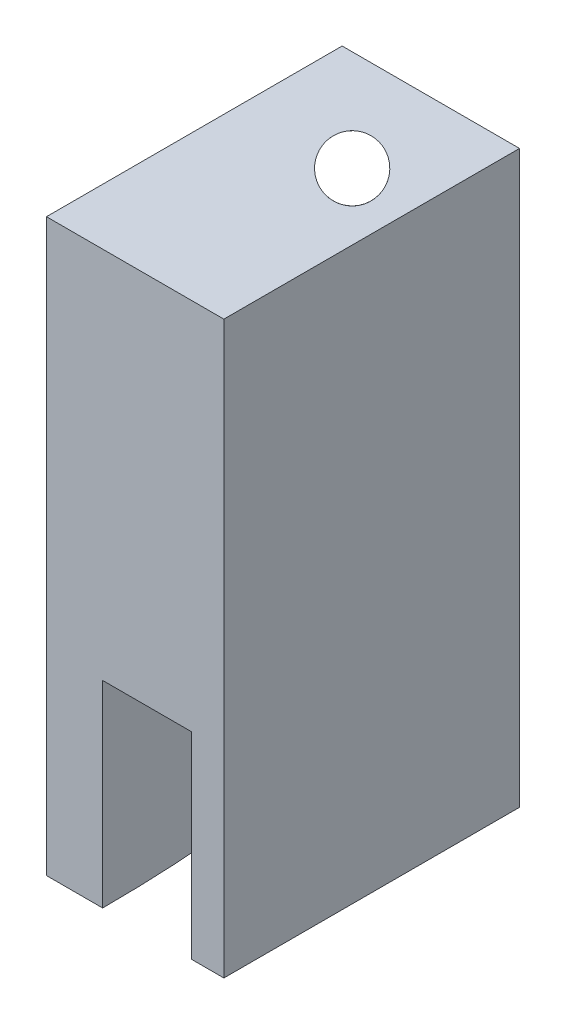
ISO-10303-21;
HEADER;
FILE_DESCRIPTION(('STEP AP214'),'2;1');
FILE_NAME('part.step','',(''),(''),'','','');
FILE_SCHEMA(('AUTOMOTIVE_DESIGN { 1 0 10303 214 1 1 1 1 }'));
ENDSEC;
DATA;
#1=APPLICATION_CONTEXT('core data for automotive mechanical design processes');
#2=APPLICATION_PROTOCOL_DEFINITION('international standard','automotive_design',2000,#1);
#3=PRODUCT_CONTEXT('',#1,'mechanical');
#4=PRODUCT('Part','Part','',(#3));
#5=PRODUCT_RELATED_PRODUCT_CATEGORY('part','',(#4));
#6=PRODUCT_DEFINITION_FORMATION('','',#4);
#7=PRODUCT_DEFINITION_CONTEXT('part definition',#1,'design');
#8=PRODUCT_DEFINITION('design','',#6,#7);
#9=PRODUCT_DEFINITION_SHAPE('','',#8);
#10=(LENGTH_UNIT() NAMED_UNIT(*) SI_UNIT(.MILLI.,.METRE.));
#11=(NAMED_UNIT(*) PLANE_ANGLE_UNIT() SI_UNIT($,.RADIAN.));
#12=(NAMED_UNIT(*) SI_UNIT($,.STERADIAN.) SOLID_ANGLE_UNIT());
#13=UNCERTAINTY_MEASURE_WITH_UNIT(LENGTH_MEASURE(1.E-05),#10,'distance_accuracy_value','');
#14=(GEOMETRIC_REPRESENTATION_CONTEXT(3) GLOBAL_UNCERTAINTY_ASSIGNED_CONTEXT((#13)) GLOBAL_UNIT_ASSIGNED_CONTEXT((#10,
#11,#12)) REPRESENTATION_CONTEXT('',''));
#15=CARTESIAN_POINT('',(0.,0.,0.));
#16=DIRECTION('',(0.,0.,1.));
#17=DIRECTION('',(1.,0.,0.));
#18=AXIS2_PLACEMENT_3D('',#15,#16,#17);
#19=CARTESIAN_POINT('',(123.5,42.,0.));
#20=DIRECTION('',(0.,0.,-1.));
#21=DIRECTION('',(-1.,0.,0.));
#22=AXIS2_PLACEMENT_3D('',#19,#20,#21);
#23=PLANE('',#22);
#24=DIRECTION('',(0.,-1.,0.));
#25=VECTOR('',#24,1.);
#26=CARTESIAN_POINT('',(113.25,16.6666666666667,0.));
#27=LINE('',#26,#25);
#28=CARTESIAN_POINT('',(113.25,16.6666666666667,0.));
#29=VERTEX_POINT('',#28);
#30=CARTESIAN_POINT('',(113.25,0.,0.));
#31=VERTEX_POINT('',#30);
#32=EDGE_CURVE('E155',#29,#31,#27,.T.);
#33=ORIENTED_EDGE('',*,*,#32,.F.);
#34=DIRECTION('',(1.,0.,0.));
#35=VECTOR('',#34,1.);
#36=CARTESIAN_POINT('',(113.25,16.6666666666667,0.));
#37=LINE('',#36,#35);
#38=CARTESIAN_POINT('',(120.75,16.6666666666667,0.));
#39=VERTEX_POINT('',#38);
#40=EDGE_CURVE('E176',#29,#39,#37,.T.);
#41=ORIENTED_EDGE('',*,*,#40,.T.);
#42=DIRECTION('',(0.,-1.,0.));
#43=VECTOR('',#42,1.);
#44=CARTESIAN_POINT('',(120.75,16.6666666666667,0.));
#45=LINE('',#44,#43);
#46=CARTESIAN_POINT('',(120.75,0.,0.));
#47=VERTEX_POINT('',#46);
#48=EDGE_CURVE('E157',#39,#47,#45,.T.);
#49=ORIENTED_EDGE('',*,*,#48,.T.);
#50=DIRECTION('',(1.,0.,0.));
#51=VECTOR('',#50,1.);
#52=CARTESIAN_POINT('',(123.5,0.,0.));
#53=LINE('',#52,#51);
#54=CARTESIAN_POINT('',(123.5,0.,0.));
#55=VERTEX_POINT('',#54);
#56=EDGE_CURVE('E145',#47,#55,#53,.T.);
#57=ORIENTED_EDGE('',*,*,#56,.T.);
#58=DIRECTION('',(0.,-1.,0.));
#59=VECTOR('',#58,1.);
#60=CARTESIAN_POINT('',(123.5,42.,0.));
#61=LINE('',#60,#59);
#62=CARTESIAN_POINT('',(123.5,48.25,0.));
#63=VERTEX_POINT('',#62);
#64=EDGE_CURVE('E45',#63,#55,#61,.T.);
#65=ORIENTED_EDGE('',*,*,#64,.F.);
#66=DIRECTION('',(1.,0.,0.));
#67=VECTOR('',#66,1.);
#68=CARTESIAN_POINT('',(108.5,48.25,0.));
#69=LINE('',#68,#67);
#70=CARTESIAN_POINT('',(108.5,48.25,0.));
#71=VERTEX_POINT('',#70);
#72=EDGE_CURVE('E183',#71,#63,#69,.T.);
#73=ORIENTED_EDGE('',*,*,#72,.F.);
#74=DIRECTION('',(0.,-1.,0.));
#75=VECTOR('',#74,1.);
#76=CARTESIAN_POINT('',(108.5,42.,0.));
#77=LINE('',#76,#75);
#78=CARTESIAN_POINT('',(108.5,0.,0.));
#79=VERTEX_POINT('',#78);
#80=EDGE_CURVE('E11',#71,#79,#77,.T.);
#81=ORIENTED_EDGE('',*,*,#80,.T.);
#82=EDGE_CURVE('E148',#79,#31,#53,.T.);
#83=ORIENTED_EDGE('',*,*,#82,.T.);
#84=EDGE_LOOP('',(#33,#41,#49,#57,#65,#73,#81,#83));
#85=FACE_BOUND('',#84,.T.);
#86=ADVANCED_FACE('F36',(#85),#23,.F.);
#87=CARTESIAN_POINT('',(123.5,42.,-25.));
#88=DIRECTION('',(0.,0.,1.));
#89=DIRECTION('',(1.,0.,0.));
#90=AXIS2_PLACEMENT_3D('',#87,#88,#89);
#91=PLANE('',#90);
#92=CARTESIAN_POINT('',(109.350288425444,39.7189330655249,-25.));
#93=DIRECTION('',(0.,0.,1.));
#94=DIRECTION('',(-0.707164241221047,-0.707049316482422,0.));
#95=AXIS2_PLACEMENT_3D('',#92,#93,#94);
#96=ELLIPSE('',#95,3.89690321539582,2.25);
#97=CARTESIAN_POINT('',(108.5,41.9491815174221,-25.));
#98=VERTEX_POINT('',#97);
#99=CARTESIAN_POINT('',(108.5,36.6385343727372,-25.));
#100=VERTEX_POINT('',#99);
#101=EDGE_CURVE('E51',#98,#100,#96,.F.);
#102=ORIENTED_EDGE('',*,*,#101,.F.);
#103=DIRECTION('',(0.,-1.,0.));
#104=VECTOR('',#103,1.);
#105=CARTESIAN_POINT('',(108.5,42.,-25.));
#106=LINE('',#105,#104);
#107=CARTESIAN_POINT('',(108.5,48.25,-25.));
#108=VERTEX_POINT('',#107);
#109=EDGE_CURVE('E114',#108,#98,#106,.T.);
#110=ORIENTED_EDGE('',*,*,#109,.F.);
#111=DIRECTION('',(-1.,0.,0.));
#112=VECTOR('',#111,1.);
#113=CARTESIAN_POINT('',(108.5,48.25,-25.));
#114=LINE('',#113,#112);
#115=CARTESIAN_POINT('',(123.5,48.25,-25.));
#116=VERTEX_POINT('',#115);
#117=EDGE_CURVE('E171',#116,#108,#114,.T.);
#118=ORIENTED_EDGE('',*,*,#117,.F.);
#119=DIRECTION('',(0.,-1.,0.));
#120=VECTOR('',#119,1.);
#121=CARTESIAN_POINT('',(123.5,42.,-25.));
#122=LINE('',#121,#120);
#123=CARTESIAN_POINT('',(123.5,0.,-25.));
#124=VERTEX_POINT('',#123);
#125=EDGE_CURVE('E122',#116,#124,#122,.T.);
#126=ORIENTED_EDGE('',*,*,#125,.T.);
#127=DIRECTION('',(-1.,0.,0.));
#128=VECTOR('',#127,1.);
#129=CARTESIAN_POINT('',(123.5,0.,-25.));
#130=LINE('',#129,#128);
#131=CARTESIAN_POINT('',(118.133663703451,0.,-25.));
#132=VERTEX_POINT('',#131);
#133=EDGE_CURVE('E126',#124,#132,#130,.T.);
#134=ORIENTED_EDGE('',*,*,#133,.T.);
#135=DIRECTION('',(0.,-1.,0.));
#136=VECTOR('',#135,1.);
#137=CARTESIAN_POINT('',(118.133663703451,16.6666666666667,-25.));
#138=LINE('',#137,#136);
#139=CARTESIAN_POINT('',(118.133663703451,16.6666666666667,-25.));
#140=VERTEX_POINT('',#139);
#141=EDGE_CURVE('E59',#140,#132,#138,.T.);
#142=ORIENTED_EDGE('',*,*,#141,.F.);
#143=DIRECTION('',(-1.,0.,0.));
#144=VECTOR('',#143,1.);
#145=CARTESIAN_POINT('',(110.45615646038,16.6666666666667,-25.));
#146=LINE('',#145,#144);
#147=CARTESIAN_POINT('',(110.45615646038,16.6666666666667,-25.));
#148=VERTEX_POINT('',#147);
#149=EDGE_CURVE('E164',#140,#148,#146,.T.);
#150=ORIENTED_EDGE('',*,*,#149,.T.);
#151=DIRECTION('',(0.,-1.,0.));
#152=VECTOR('',#151,1.);
#153=CARTESIAN_POINT('',(110.45615646038,16.6666666666667,-25.));
#154=LINE('',#153,#152);
#155=CARTESIAN_POINT('',(110.45615646038,0.,-25.));
#156=VERTEX_POINT('',#155);
#157=EDGE_CURVE('E161',#148,#156,#154,.T.);
#158=ORIENTED_EDGE('',*,*,#157,.T.);
#159=CARTESIAN_POINT('',(108.5,0.,-25.));
#160=VERTEX_POINT('',#159);
#161=EDGE_CURVE('E147',#156,#160,#130,.T.);
#162=ORIENTED_EDGE('',*,*,#161,.T.);
#163=EDGE_CURVE('E117',#100,#160,#106,.T.);
#164=ORIENTED_EDGE('',*,*,#163,.F.);
#165=EDGE_LOOP('',(#102,#110,#118,#126,#134,#142,#150,#158,#162,#164));
#166=FACE_BOUND('',#165,.T.);
#167=ADVANCED_FACE('F112',(#166),#91,.F.);
#168=CARTESIAN_POINT('',(0.,0.,0.));
#169=DIRECTION('',(0.,-1.,0.));
#170=DIRECTION('',(0.,0.,-1.));
#171=AXIS2_PLACEMENT_3D('',#168,#169,#170);
#172=PLANE('',#171);
#173=ORIENTED_EDGE('',*,*,#161,.F.);
#174=CARTESIAN_POINT('',(0.,0.,0.));
#175=DIRECTION('',(0.,-1.,0.));
#176=DIRECTION('',(0.,0.,1.));
#177=AXIS2_PLACEMENT_3D('',#174,#175,#176);
#178=CIRCLE('',#177,113.25);
#179=EDGE_CURVE('E168',#156,#31,#178,.T.);
#180=ORIENTED_EDGE('',*,*,#179,.T.);
#181=ORIENTED_EDGE('',*,*,#82,.F.);
#182=DIRECTION('',(0.,0.,1.));
#183=VECTOR('',#182,1.);
#184=CARTESIAN_POINT('',(108.5,0.,-25.));
#185=LINE('',#184,#183);
#186=EDGE_CURVE('E152',#160,#79,#185,.T.);
#187=ORIENTED_EDGE('',*,*,#186,.F.);
#188=EDGE_LOOP('',(#173,#180,#181,#187));
#189=FACE_BOUND('',#188,.T.);
#190=ADVANCED_FACE('F198',(#189),#172,.T.);
#191=ORIENTED_EDGE('',*,*,#56,.F.);
#192=CARTESIAN_POINT('',(0.,0.,0.));
#193=DIRECTION('',(0.,1.,0.));
#194=DIRECTION('',(0.,0.,1.));
#195=AXIS2_PLACEMENT_3D('',#192,#193,#194);
#196=CIRCLE('',#195,120.75);
#197=EDGE_CURVE('E165',#47,#132,#196,.T.);
#198=ORIENTED_EDGE('',*,*,#197,.T.);
#199=ORIENTED_EDGE('',*,*,#133,.F.);
#200=DIRECTION('',(0.,0.,-1.));
#201=VECTOR('',#200,1.);
#202=CARTESIAN_POINT('',(123.5,0.,-25.));
#203=LINE('',#202,#201);
#204=EDGE_CURVE('E135',#55,#124,#203,.T.);
#205=ORIENTED_EDGE('',*,*,#204,.F.);
#206=EDGE_LOOP('',(#191,#198,#199,#205));
#207=FACE_BOUND('',#206,.T.);
#208=ADVANCED_FACE('F144',(#207),#172,.T.);
#209=CARTESIAN_POINT('',(108.5,42.,-25.));
#210=DIRECTION('',(1.,0.,0.));
#211=DIRECTION('',(0.,0.,-1.));
#212=AXIS2_PLACEMENT_3D('',#209,#210,#211);
#213=PLANE('',#212);
#214=CARTESIAN_POINT('',(108.5,38.8687828246344,-25.8502884254442));
#215=DIRECTION('',(1.,0.,0.));
#216=DIRECTION('',(0.,-0.707049316482423,-0.707164241221046));
#217=AXIS2_PLACEMENT_3D('',#214,#215,#216);
#218=ELLIPSE('',#217,3.8969032153958,2.25);
#219=EDGE_CURVE('E105',#100,#98,#218,.F.);
#220=ORIENTED_EDGE('',*,*,#219,.F.);
#221=ORIENTED_EDGE('',*,*,#163,.T.);
#222=ORIENTED_EDGE('',*,*,#186,.T.);
#223=ORIENTED_EDGE('',*,*,#80,.F.);
#224=DIRECTION('',(0.,0.,1.));
#225=VECTOR('',#224,1.);
#226=CARTESIAN_POINT('',(108.5,48.25,0.));
#227=LINE('',#226,#225);
#228=EDGE_CURVE('E118',#108,#71,#227,.T.);
#229=ORIENTED_EDGE('',*,*,#228,.F.);
#230=ORIENTED_EDGE('',*,*,#109,.T.);
#231=EDGE_LOOP('',(#220,#221,#222,#223,#229,#230));
#232=FACE_BOUND('',#231,.T.);
#233=ADVANCED_FACE('F38',(#232),#213,.F.);
#234=CARTESIAN_POINT('',(123.5,42.,-25.));
#235=DIRECTION('',(-1.,0.,0.));
#236=DIRECTION('',(0.,0.,1.));
#237=AXIS2_PLACEMENT_3D('',#234,#235,#236);
#238=PLANE('',#237);
#239=ORIENTED_EDGE('',*,*,#204,.T.);
#240=ORIENTED_EDGE('',*,*,#125,.F.);
#241=DIRECTION('',(0.,0.,-1.));
#242=VECTOR('',#241,1.);
#243=CARTESIAN_POINT('',(123.5,48.25,0.));
#244=LINE('',#243,#242);
#245=EDGE_CURVE('E137',#63,#116,#244,.T.);
#246=ORIENTED_EDGE('',*,*,#245,.F.);
#247=ORIENTED_EDGE('',*,*,#64,.T.);
#248=EDGE_LOOP('',(#239,#240,#246,#247));
#249=FACE_BOUND('',#248,.T.);
#250=ADVANCED_FACE('F134',(#249),#238,.F.);
#251=CARTESIAN_POINT('',(0.,16.6666666666667,0.));
#252=DIRECTION('',(0.,-1.,0.));
#253=DIRECTION('',(0.,0.,-1.));
#254=AXIS2_PLACEMENT_3D('',#251,#252,#253);
#255=CYLINDRICAL_SURFACE('',#254,113.25);
#256=ORIENTED_EDGE('',*,*,#179,.F.);
#257=ORIENTED_EDGE('',*,*,#157,.F.);
#258=CARTESIAN_POINT('',(0.,16.6666666666667,0.));
#259=DIRECTION('',(0.,-1.,0.));
#260=DIRECTION('',(0.,0.,1.));
#261=AXIS2_PLACEMENT_3D('',#258,#259,#260);
#262=CIRCLE('',#261,113.25);
#263=EDGE_CURVE('E167',#148,#29,#262,.T.);
#264=ORIENTED_EDGE('',*,*,#263,.T.);
#265=ORIENTED_EDGE('',*,*,#32,.T.);
#266=EDGE_LOOP('',(#256,#257,#264,#265));
#267=FACE_BOUND('',#266,.T.);
#268=ADVANCED_FACE('F195',(#267),#255,.T.);
#269=CARTESIAN_POINT('',(0.,16.6666666666667,0.));
#270=DIRECTION('',(0.,-1.,0.));
#271=DIRECTION('',(0.,0.,-1.));
#272=AXIS2_PLACEMENT_3D('',#269,#270,#271);
#273=CYLINDRICAL_SURFACE('',#272,120.75);
#274=ORIENTED_EDGE('',*,*,#197,.F.);
#275=ORIENTED_EDGE('',*,*,#48,.F.);
#276=CARTESIAN_POINT('',(0.,16.6666666666667,0.));
#277=DIRECTION('',(0.,1.,0.));
#278=DIRECTION('',(0.,0.,1.));
#279=AXIS2_PLACEMENT_3D('',#276,#277,#278);
#280=CIRCLE('',#279,120.75);
#281=EDGE_CURVE('E174',#39,#140,#280,.T.);
#282=ORIENTED_EDGE('',*,*,#281,.T.);
#283=ORIENTED_EDGE('',*,*,#141,.T.);
#284=EDGE_LOOP('',(#274,#275,#282,#283));
#285=FACE_BOUND('',#284,.T.);
#286=ADVANCED_FACE('F216',(#285),#273,.F.);
#287=CARTESIAN_POINT('',(0.,16.6666666666667,0.));
#288=DIRECTION('',(0.,1.,0.));
#289=DIRECTION('',(0.,0.,1.));
#290=AXIS2_PLACEMENT_3D('',#287,#288,#289);
#291=PLANE('',#290);
#292=ORIENTED_EDGE('',*,*,#263,.F.);
#293=ORIENTED_EDGE('',*,*,#149,.F.);
#294=ORIENTED_EDGE('',*,*,#281,.F.);
#295=ORIENTED_EDGE('',*,*,#40,.F.);
#296=EDGE_LOOP('',(#292,#293,#294,#295));
#297=FACE_BOUND('',#296,.T.);
#298=ADVANCED_FACE('F192',(#297),#291,.F.);
#299=CARTESIAN_POINT('',(0.,48.25,0.));
#300=DIRECTION('',(0.,-1.,0.));
#301=DIRECTION('',(0.,0.,-1.));
#302=AXIS2_PLACEMENT_3D('',#299,#300,#301);
#303=PLANE('',#302);
#304=CARTESIAN_POINT('',(117.882742010913,48.25,-16.4675464145308));
#305=DIRECTION('',(0.,-1.,0.));
#306=DIRECTION('',(-0.707106781186549,0.,-0.707106781186546));
#307=AXIS2_PLACEMENT_3D('',#304,#305,#306);
#308=ELLIPSE('',#307,3.89753662324026,2.25);
#309=CARTESIAN_POINT('',(115.126767434697,48.25,-19.2235209907469));
#310=VERTEX_POINT('',#309);
#311=EDGE_CURVE('E40',#310,#310,#308,.F.);
#312=ORIENTED_EDGE('',*,*,#311,.F.);
#313=EDGE_LOOP('',(#312));
#314=FACE_BOUND('',#313,.T.);
#315=ORIENTED_EDGE('',*,*,#228,.T.);
#316=ORIENTED_EDGE('',*,*,#72,.T.);
#317=ORIENTED_EDGE('',*,*,#245,.T.);
#318=ORIENTED_EDGE('',*,*,#117,.T.);
#319=EDGE_LOOP('',(#315,#316,#317,#318));
#320=FACE_BOUND('',#319,.T.);
#321=ADVANCED_FACE('F186',(#314,#320),#303,.F.);
#322=CARTESIAN_POINT('',(128.519197342082,58.8847267485037,-5.83109108336187));
#323=DIRECTION('',(-0.577381545199981,-0.577287712085548,-0.577381545199979));
#324=DIRECTION('',(-0.707106781186546,0.,0.707106781186549));
#325=AXIS2_PLACEMENT_3D('',#322,#323,#324);
#326=CYLINDRICAL_SURFACE('',#325,2.25);
#327=ORIENTED_EDGE('',*,*,#311,.T.);
#328=EDGE_LOOP('',(#327));
#329=FACE_BOUND('',#328,.T.);
#330=ORIENTED_EDGE('',*,*,#101,.T.);
#331=ORIENTED_EDGE('',*,*,#219,.T.);
#332=EDGE_LOOP('',(#330,#331));
#333=FACE_BOUND('',#332,.T.);
#334=ADVANCED_FACE('F106',(#329,#333),#326,.F.);
#335=CLOSED_SHELL('',(#86,#167,#190,#208,#233,#250,#268,#286,#298,#321,#334));
#336=MANIFOLD_SOLID_BREP('B2',#335);
#337=ADVANCED_BREP_SHAPE_REPRESENTATION('',(#18,#336),#14);
#338=SHAPE_DEFINITION_REPRESENTATION(#9,#337);
ENDSEC;
END-ISO-10303-21;
